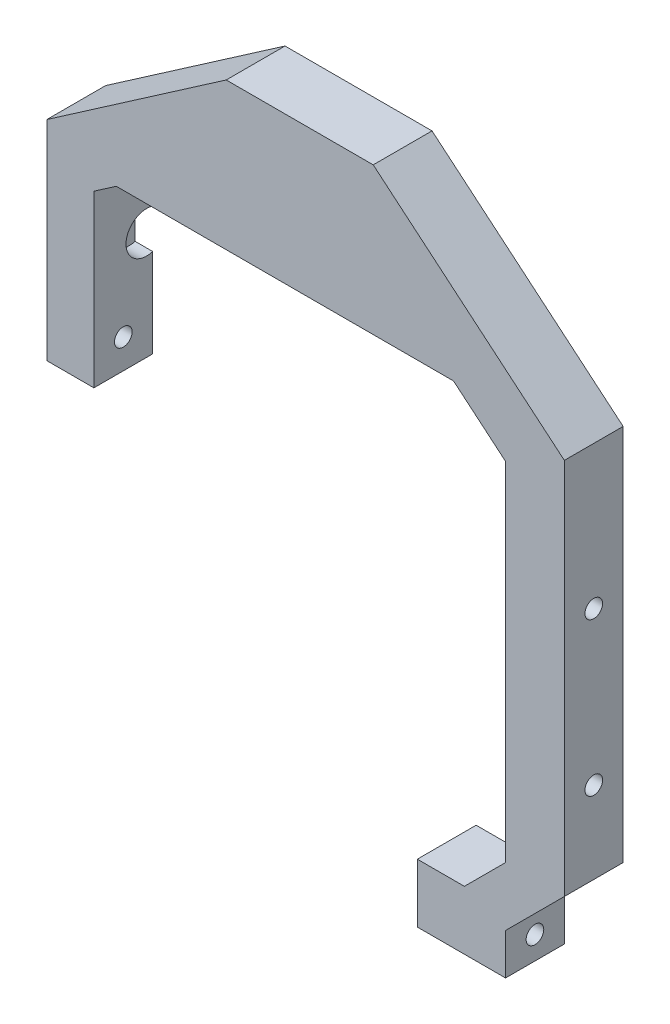
ISO-10303-21;
HEADER;
FILE_DESCRIPTION(('STEP AP214'),'2;1');
FILE_NAME('part.step','',(''),(''),'','','');
FILE_SCHEMA(('AUTOMOTIVE_DESIGN { 1 0 10303 214 1 1 1 1 }'));
ENDSEC;
DATA;
#1=APPLICATION_CONTEXT('core data for automotive mechanical design processes');
#2=APPLICATION_PROTOCOL_DEFINITION('international standard','automotive_design',2000,#1);
#3=PRODUCT_CONTEXT('',#1,'mechanical');
#4=PRODUCT('Part','Part','',(#3));
#5=PRODUCT_RELATED_PRODUCT_CATEGORY('part','',(#4));
#6=PRODUCT_DEFINITION_FORMATION('','',#4);
#7=PRODUCT_DEFINITION_CONTEXT('part definition',#1,'design');
#8=PRODUCT_DEFINITION('design','',#6,#7);
#9=PRODUCT_DEFINITION_SHAPE('','',#8);
#10=(LENGTH_UNIT() NAMED_UNIT(*) SI_UNIT(.MILLI.,.METRE.));
#11=(NAMED_UNIT(*) PLANE_ANGLE_UNIT() SI_UNIT($,.RADIAN.));
#12=(NAMED_UNIT(*) SI_UNIT($,.STERADIAN.) SOLID_ANGLE_UNIT());
#13=UNCERTAINTY_MEASURE_WITH_UNIT(LENGTH_MEASURE(1.E-05),#10,'distance_accuracy_value','');
#14=(GEOMETRIC_REPRESENTATION_CONTEXT(3) GLOBAL_UNCERTAINTY_ASSIGNED_CONTEXT((#13)) GLOBAL_UNIT_ASSIGNED_CONTEXT((#10,
#11,#12)) REPRESENTATION_CONTEXT('',''));
#15=CARTESIAN_POINT('',(0.,0.,0.));
#16=DIRECTION('',(0.,0.,1.));
#17=DIRECTION('',(1.,0.,0.));
#18=AXIS2_PLACEMENT_3D('',#15,#16,#17);
#19=CARTESIAN_POINT('',(-43.6903409986961,-25.0000000000002,10.));
#20=DIRECTION('',(-0.568508389326176,0.822677464906969,0.));
#21=DIRECTION('',(-0.822677464906969,-0.568508389326176,0.));
#22=AXIS2_PLACEMENT_3D('',#19,#20,#21);
#23=PLANE('',#22);
#24=DIRECTION('',(0.822677464906969,0.568508389326176,0.));
#25=VECTOR('',#24,1.);
#26=CARTESIAN_POINT('',(-43.6903409986961,-25.0000000000002,0.));
#27=LINE('',#26,#25);
#28=CARTESIAN_POINT('',(-47.5000000000006,-27.632651549485,0.));
#29=VERTEX_POINT('',#28);
#30=CARTESIAN_POINT('',(-43.6903409986961,-25.0000000000002,0.));
#31=VERTEX_POINT('',#30);
#32=EDGE_CURVE('E464',#29,#31,#27,.T.);
#33=ORIENTED_EDGE('',*,*,#32,.T.);
#34=DIRECTION('',(0.,0.,-1.));
#35=VECTOR('',#34,1.);
#36=CARTESIAN_POINT('',(-43.6903409986961,-25.0000000000002,10.));
#37=LINE('',#36,#35);
#38=CARTESIAN_POINT('',(-43.6903409986961,-25.0000000000002,10.));
#39=VERTEX_POINT('',#38);
#40=EDGE_CURVE('E268',#39,#31,#37,.T.);
#41=ORIENTED_EDGE('',*,*,#40,.F.);
#42=DIRECTION('',(0.822677464906969,0.568508389326176,0.));
#43=VECTOR('',#42,1.);
#44=CARTESIAN_POINT('',(-43.6903409986961,-25.0000000000002,10.));
#45=LINE('',#44,#43);
#46=CARTESIAN_POINT('',(-47.5000000000006,-27.632651549485,10.));
#47=VERTEX_POINT('',#46);
#48=EDGE_CURVE('E467',#47,#39,#45,.T.);
#49=ORIENTED_EDGE('',*,*,#48,.F.);
#50=DIRECTION('',(0.,0.,-1.));
#51=VECTOR('',#50,1.);
#52=CARTESIAN_POINT('',(-47.5000000000006,-27.632651549485,10.));
#53=LINE('',#52,#51);
#54=EDGE_CURVE('E271',#47,#29,#53,.T.);
#55=ORIENTED_EDGE('',*,*,#54,.T.);
#56=EDGE_LOOP('',(#33,#41,#49,#55));
#57=FACE_BOUND('',#56,.T.);
#58=ADVANCED_FACE('F33',(#57),#23,.F.);
#59=CARTESIAN_POINT('',(13.6614108506336,-25.0000000000002,10.));
#60=DIRECTION('',(0.,1.,0.));
#61=DIRECTION('',(0.,0.,1.));
#62=AXIS2_PLACEMENT_3D('',#59,#60,#61);
#63=PLANE('',#62);
#64=DIRECTION('',(1.,0.,0.));
#65=VECTOR('',#64,1.);
#66=CARTESIAN_POINT('',(13.6614108506336,-25.0000000000002,0.));
#67=LINE('',#66,#65);
#68=CARTESIAN_POINT('',(13.6614108506336,-25.0000000000002,0.));
#69=VERTEX_POINT('',#68);
#70=EDGE_CURVE('E495',#31,#69,#67,.T.);
#71=ORIENTED_EDGE('',*,*,#70,.T.);
#72=DIRECTION('',(0.,0.,-1.));
#73=VECTOR('',#72,1.);
#74=CARTESIAN_POINT('',(13.6614108506336,-25.0000000000002,10.));
#75=LINE('',#74,#73);
#76=CARTESIAN_POINT('',(13.6614108506336,-25.0000000000002,10.));
#77=VERTEX_POINT('',#76);
#78=EDGE_CURVE('E265',#77,#69,#75,.T.);
#79=ORIENTED_EDGE('',*,*,#78,.F.);
#80=DIRECTION('',(1.,0.,0.));
#81=VECTOR('',#80,1.);
#82=CARTESIAN_POINT('',(-35.8578643762684,-25.0000000000002,10.));
#83=LINE('',#82,#81);
#84=EDGE_CURVE('E469',#39,#77,#83,.T.);
#85=ORIENTED_EDGE('',*,*,#84,.F.);
#86=ORIENTED_EDGE('',*,*,#40,.T.);
#87=EDGE_LOOP('',(#71,#79,#85,#86));
#88=FACE_BOUND('',#87,.T.);
#89=ADVANCED_FACE('F320',(#88),#63,.F.);
#90=CARTESIAN_POINT('',(13.6614108506336,-25.0000000000002,10.));
#91=DIRECTION('',(0.64278760968654,0.766044443118977,0.));
#92=DIRECTION('',(-0.766044443118977,0.64278760968654,0.));
#93=AXIS2_PLACEMENT_3D('',#90,#91,#92);
#94=PLANE('',#93);
#95=DIRECTION('',(0.766044443118977,-0.64278760968654,0.));
#96=VECTOR('',#95,1.);
#97=CARTESIAN_POINT('',(13.6614108506336,-25.0000000000002,0.));
#98=LINE('',#97,#96);
#99=CARTESIAN_POINT('',(22.4999999999994,-32.4164568953606,0.));
#100=VERTEX_POINT('',#99);
#101=EDGE_CURVE('E209',#69,#100,#98,.T.);
#102=ORIENTED_EDGE('',*,*,#101,.T.);
#103=DIRECTION('',(0.,0.,-1.));
#104=VECTOR('',#103,1.);
#105=CARTESIAN_POINT('',(22.4999999999994,-32.4164568953606,10.));
#106=LINE('',#105,#104);
#107=CARTESIAN_POINT('',(22.4999999999994,-32.4164568953606,10.));
#108=VERTEX_POINT('',#107);
#109=EDGE_CURVE('E262',#108,#100,#106,.T.);
#110=ORIENTED_EDGE('',*,*,#109,.F.);
#111=DIRECTION('',(0.766044443118977,-0.64278760968654,0.));
#112=VECTOR('',#111,1.);
#113=CARTESIAN_POINT('',(13.6614108506336,-25.0000000000002,10.));
#114=LINE('',#113,#112);
#115=EDGE_CURVE('E471',#77,#108,#114,.T.);
#116=ORIENTED_EDGE('',*,*,#115,.F.);
#117=ORIENTED_EDGE('',*,*,#78,.T.);
#118=EDGE_LOOP('',(#102,#110,#116,#117));
#119=FACE_BOUND('',#118,.T.);
#120=ADVANCED_FACE('F325',(#119),#94,.F.);
#121=CARTESIAN_POINT('',(22.4999999999994,-98.4999999999977,10.));
#122=DIRECTION('',(1.,0.,0.));
#123=DIRECTION('',(0.,1.,0.));
#124=AXIS2_PLACEMENT_3D('',#121,#122,#123);
#125=PLANE('',#124);
#126=CARTESIAN_POINT('',(22.4999999999994,-77.5937015555197,5.));
#127=DIRECTION('',(1.,0.,0.));
#128=DIRECTION('',(0.,1.,0.));
#129=AXIS2_PLACEMENT_3D('',#126,#127,#128);
#130=CIRCLE('',#129,1.5);
#131=CARTESIAN_POINT('',(22.4999999999994,-76.0937015555197,5.));
#132=VERTEX_POINT('',#131);
#133=EDGE_CURVE('E454',#132,#132,#130,.F.);
#134=ORIENTED_EDGE('',*,*,#133,.F.);
#135=EDGE_LOOP('',(#134));
#136=FACE_BOUND('',#135,.T.);
#137=CARTESIAN_POINT('',(22.4999999999994,-51.5937015555197,5.));
#138=DIRECTION('',(1.,0.,0.));
#139=DIRECTION('',(0.,1.,0.));
#140=AXIS2_PLACEMENT_3D('',#137,#138,#139);
#141=CIRCLE('',#140,1.5);
#142=CARTESIAN_POINT('',(22.4999999999994,-50.0937015555197,5.));
#143=VERTEX_POINT('',#142);
#144=EDGE_CURVE('E278',#143,#143,#141,.T.);
#145=ORIENTED_EDGE('',*,*,#144,.T.);
#146=EDGE_LOOP('',(#145));
#147=FACE_BOUND('',#146,.T.);
#148=DIRECTION('',(0.,-1.,0.));
#149=VECTOR('',#148,1.);
#150=CARTESIAN_POINT('',(22.4999999999994,-98.4999999999977,0.));
#151=LINE('',#150,#149);
#152=CARTESIAN_POINT('',(22.4999999999994,-41.5096451357993,0.));
#153=VERTEX_POINT('',#152);
#154=CARTESIAN_POINT('',(22.4999999999994,-60.8234583821298,0.));
#155=VERTEX_POINT('',#154);
#156=EDGE_CURVE('E199',#153,#155,#151,.T.);
#157=ORIENTED_EDGE('',*,*,#156,.T.);
#158=CARTESIAN_POINT('',(22.4999999999994,-64.1665517589566,1.03620783323595));
#159=DIRECTION('',(-1.,0.,0.));
#160=DIRECTION('',(0.,-1.,0.));
#161=AXIS2_PLACEMENT_3D('',#158,#159,#160);
#162=CIRCLE('',#161,3.49999999997753);
#163=CARTESIAN_POINT('',(22.4999999999994,-67.5096451357834,0.));
#164=VERTEX_POINT('',#163);
#165=EDGE_CURVE('E186',#164,#155,#162,.T.);
#166=ORIENTED_EDGE('',*,*,#165,.F.);
#167=CARTESIAN_POINT('',(22.4999999999994,-91.4999999999977,0.));
#168=VERTEX_POINT('',#167);
#169=EDGE_CURVE('E206',#164,#168,#151,.T.);
#170=ORIENTED_EDGE('',*,*,#169,.T.);
#171=DIRECTION('',(0.,0.,1.));
#172=VECTOR('',#171,1.);
#173=CARTESIAN_POINT('',(22.4999999999994,-91.4999999999977,10.));
#174=LINE('',#173,#172);
#175=CARTESIAN_POINT('',(22.4999999999994,-91.4999999999977,10.));
#176=VERTEX_POINT('',#175);
#177=EDGE_CURVE('E282',#168,#176,#174,.T.);
#178=ORIENTED_EDGE('',*,*,#177,.T.);
#179=DIRECTION('',(0.,-1.,0.));
#180=VECTOR('',#179,1.);
#181=CARTESIAN_POINT('',(22.4999999999994,-98.4999999999977,10.));
#182=LINE('',#181,#180);
#183=EDGE_CURVE('E473',#108,#176,#182,.T.);
#184=ORIENTED_EDGE('',*,*,#183,.F.);
#185=ORIENTED_EDGE('',*,*,#109,.T.);
#186=CARTESIAN_POINT('',(22.4999999999994,-34.8234583820987,0.));
#187=VERTEX_POINT('',#186);
#188=EDGE_CURVE('E205',#100,#187,#151,.T.);
#189=ORIENTED_EDGE('',*,*,#188,.T.);
#190=CARTESIAN_POINT('',(22.4999999999994,-38.166551758949,1.03620783323595));
#191=DIRECTION('',(-1.,0.,0.));
#192=DIRECTION('',(0.,-1.,0.));
#193=AXIS2_PLACEMENT_3D('',#190,#191,#192);
#194=CIRCLE('',#193,3.5);
#195=EDGE_CURVE('E204',#153,#187,#194,.T.);
#196=ORIENTED_EDGE('',*,*,#195,.F.);
#197=EDGE_LOOP('',(#157,#166,#170,#178,#184,#185,#189,#196));
#198=FACE_BOUND('',#197,.T.);
#199=ADVANCED_FACE('F202',(#136,#147,#198),#125,.F.);
#200=CARTESIAN_POINT('',(22.4999999999994,-98.4999999999977,10.));
#201=DIRECTION('',(0.,-1.,0.));
#202=DIRECTION('',(0.,0.,-1.));
#203=AXIS2_PLACEMENT_3D('',#200,#201,#202);
#204=PLANE('',#203);
#205=DIRECTION('',(-1.,0.,0.));
#206=VECTOR('',#205,1.);
#207=CARTESIAN_POINT('',(22.4999999999994,-98.4999999999977,10.));
#208=LINE('',#207,#206);
#209=CARTESIAN_POINT('',(15.4999999999993,-98.4999999999977,10.));
#210=VERTEX_POINT('',#209);
#211=CARTESIAN_POINT('',(7.49999999999936,-98.4999999999977,10.));
#212=VERTEX_POINT('',#211);
#213=EDGE_CURVE('E476',#210,#212,#208,.T.);
#214=ORIENTED_EDGE('',*,*,#213,.F.);
#215=DIRECTION('',(0.,0.,-1.));
#216=VECTOR('',#215,1.);
#217=CARTESIAN_POINT('',(15.4999999999993,-98.4999999999977,0.));
#218=LINE('',#217,#216);
#219=CARTESIAN_POINT('',(15.4999999999993,-98.4999999999977,0.));
#220=VERTEX_POINT('',#219);
#221=EDGE_CURVE('E274',#210,#220,#218,.T.);
#222=ORIENTED_EDGE('',*,*,#221,.T.);
#223=DIRECTION('',(-1.,0.,0.));
#224=VECTOR('',#223,1.);
#225=CARTESIAN_POINT('',(22.4999999999994,-98.4999999999977,0.));
#226=LINE('',#225,#224);
#227=CARTESIAN_POINT('',(7.49999999999936,-98.4999999999977,0.));
#228=VERTEX_POINT('',#227);
#229=EDGE_CURVE('E208',#220,#228,#226,.T.);
#230=ORIENTED_EDGE('',*,*,#229,.T.);
#231=DIRECTION('',(0.,0.,-1.));
#232=VECTOR('',#231,1.);
#233=CARTESIAN_POINT('',(7.49999999999936,-98.4999999999977,10.));
#234=LINE('',#233,#232);
#235=EDGE_CURVE('E259',#212,#228,#234,.T.);
#236=ORIENTED_EDGE('',*,*,#235,.F.);
#237=EDGE_LOOP('',(#214,#222,#230,#236));
#238=FACE_BOUND('',#237,.T.);
#239=ADVANCED_FACE('F335',(#238),#204,.F.);
#240=CARTESIAN_POINT('',(7.49999999999936,-98.4999999999977,10.));
#241=DIRECTION('',(1.,0.,0.));
#242=DIRECTION('',(0.,0.,-1.));
#243=AXIS2_PLACEMENT_3D('',#240,#241,#242);
#244=PLANE('',#243);
#245=CARTESIAN_POINT('',(7.49999999999936,-104.593701555524,5.));
#246=DIRECTION('',(1.,0.,0.));
#247=DIRECTION('',(0.,0.,-1.));
#248=AXIS2_PLACEMENT_3D('',#245,#246,#247);
#249=CIRCLE('',#248,1.50000000000797);
#250=CARTESIAN_POINT('',(7.49999999999936,-104.593701555524,3.49999999999204));
#251=VERTEX_POINT('',#250);
#252=EDGE_CURVE('E430',#251,#251,#249,.F.);
#253=ORIENTED_EDGE('',*,*,#252,.F.);
#254=EDGE_LOOP('',(#253));
#255=FACE_BOUND('',#254,.T.);
#256=DIRECTION('',(0.,-1.,0.));
#257=VECTOR('',#256,1.);
#258=CARTESIAN_POINT('',(7.49999999999936,-98.4999999999977,0.));
#259=LINE('',#258,#257);
#260=CARTESIAN_POINT('',(7.49999999999936,-108.499999999998,0.));
#261=VERTEX_POINT('',#260);
#262=EDGE_CURVE('E214',#228,#261,#259,.T.);
#263=ORIENTED_EDGE('',*,*,#262,.T.);
#264=DIRECTION('',(0.,0.,-1.));
#265=VECTOR('',#264,1.);
#266=CARTESIAN_POINT('',(7.49999999999936,-108.499999999998,10.));
#267=LINE('',#266,#265);
#268=CARTESIAN_POINT('',(7.49999999999936,-108.499999999998,10.));
#269=VERTEX_POINT('',#268);
#270=EDGE_CURVE('E256',#269,#261,#267,.T.);
#271=ORIENTED_EDGE('',*,*,#270,.F.);
#272=DIRECTION('',(0.,-1.,0.));
#273=VECTOR('',#272,1.);
#274=CARTESIAN_POINT('',(7.49999999999936,-98.4999999999977,10.));
#275=LINE('',#274,#273);
#276=EDGE_CURVE('E478',#212,#269,#275,.T.);
#277=ORIENTED_EDGE('',*,*,#276,.F.);
#278=ORIENTED_EDGE('',*,*,#235,.T.);
#279=EDGE_LOOP('',(#263,#271,#277,#278));
#280=FACE_BOUND('',#279,.T.);
#281=ADVANCED_FACE('F339',(#255,#280),#244,.F.);
#282=CARTESIAN_POINT('',(32.4999999999994,-108.499999999998,10.));
#283=DIRECTION('',(0.,1.,0.));
#284=DIRECTION('',(-1.,0.,0.));
#285=AXIS2_PLACEMENT_3D('',#282,#283,#284);
#286=PLANE('',#285);
#287=DIRECTION('',(1.,0.,0.));
#288=VECTOR('',#287,1.);
#289=CARTESIAN_POINT('',(32.4999999999994,-108.499999999998,0.));
#290=LINE('',#289,#288);
#291=CARTESIAN_POINT('',(22.4999999999997,-108.499999999998,0.));
#292=VERTEX_POINT('',#291);
#293=EDGE_CURVE('E216',#261,#292,#290,.T.);
#294=ORIENTED_EDGE('',*,*,#293,.T.);
#295=DIRECTION('',(0.,0.,1.));
#296=VECTOR('',#295,1.);
#297=CARTESIAN_POINT('',(22.4999999999997,-108.499999999998,-0.000999999999999265));
#298=LINE('',#297,#296);
#299=CARTESIAN_POINT('',(22.4999999999997,-108.499999999998,10.));
#300=VERTEX_POINT('',#299);
#301=EDGE_CURVE('E445',#292,#300,#298,.T.);
#302=ORIENTED_EDGE('',*,*,#301,.T.);
#303=DIRECTION('',(1.,0.,0.));
#304=VECTOR('',#303,1.);
#305=CARTESIAN_POINT('',(32.4999999999994,-108.499999999998,10.));
#306=LINE('',#305,#304);
#307=EDGE_CURVE('E480',#269,#300,#306,.T.);
#308=ORIENTED_EDGE('',*,*,#307,.F.);
#309=ORIENTED_EDGE('',*,*,#270,.T.);
#310=EDGE_LOOP('',(#294,#302,#308,#309));
#311=FACE_BOUND('',#310,.T.);
#312=ADVANCED_FACE('F343',(#311),#286,.F.);
#313=CARTESIAN_POINT('',(32.4999999999994,-27.2707380132612,10.));
#314=DIRECTION('',(-1.,0.,0.));
#315=DIRECTION('',(0.,-1.,0.));
#316=AXIS2_PLACEMENT_3D('',#313,#314,#315);
#317=PLANE('',#316);
#318=CARTESIAN_POINT('',(32.4999999999994,-77.5937015555197,5.));
#319=DIRECTION('',(1.,0.,0.));
#320=DIRECTION('',(0.,1.,0.));
#321=AXIS2_PLACEMENT_3D('',#318,#319,#320);
#322=CIRCLE('',#321,1.5);
#323=CARTESIAN_POINT('',(32.4999999999994,-76.0937015555197,5.));
#324=VERTEX_POINT('',#323);
#325=EDGE_CURVE('E448',#324,#324,#322,.T.);
#326=ORIENTED_EDGE('',*,*,#325,.F.);
#327=EDGE_LOOP('',(#326));
#328=FACE_BOUND('',#327,.T.);
#329=CARTESIAN_POINT('',(32.4999999999994,-51.5937015555197,5.));
#330=DIRECTION('',(-1.,0.,0.));
#331=DIRECTION('',(0.,-1.,0.));
#332=AXIS2_PLACEMENT_3D('',#329,#330,#331);
#333=CIRCLE('',#332,1.5);
#334=CARTESIAN_POINT('',(32.4999999999994,-53.0937015555197,5.));
#335=VERTEX_POINT('',#334);
#336=EDGE_CURVE('E279',#335,#335,#333,.T.);
#337=ORIENTED_EDGE('',*,*,#336,.T.);
#338=EDGE_LOOP('',(#337));
#339=FACE_BOUND('',#338,.T.);
#340=DIRECTION('',(0.,1.,0.));
#341=VECTOR('',#340,1.);
#342=CARTESIAN_POINT('',(32.4999999999994,-40.4999999999977,10.));
#343=LINE('',#342,#341);
#344=CARTESIAN_POINT('',(32.4999999999997,-91.4999999999977,10.));
#345=VERTEX_POINT('',#344);
#346=CARTESIAN_POINT('',(32.4999999999994,-27.2707380132612,10.));
#347=VERTEX_POINT('',#346);
#348=EDGE_CURVE('E483',#345,#347,#343,.T.);
#349=ORIENTED_EDGE('',*,*,#348,.F.);
#350=DIRECTION('',(0.,0.,1.));
#351=VECTOR('',#350,1.);
#352=CARTESIAN_POINT('',(32.4999999999997,-91.4999999999977,-0.000999999999999265));
#353=LINE('',#352,#351);
#354=CARTESIAN_POINT('',(32.4999999999997,-91.4999999999977,0.));
#355=VERTEX_POINT('',#354);
#356=EDGE_CURVE('E444',#355,#345,#353,.T.);
#357=ORIENTED_EDGE('',*,*,#356,.F.);
#358=DIRECTION('',(0.,1.,0.));
#359=VECTOR('',#358,1.);
#360=CARTESIAN_POINT('',(32.4999999999994,-27.2707380132612,0.));
#361=LINE('',#360,#359);
#362=CARTESIAN_POINT('',(32.4999999999994,-27.2707380132612,0.));
#363=VERTEX_POINT('',#362);
#364=EDGE_CURVE('E219',#355,#363,#361,.T.);
#365=ORIENTED_EDGE('',*,*,#364,.T.);
#366=DIRECTION('',(0.,0.,-1.));
#367=VECTOR('',#366,1.);
#368=CARTESIAN_POINT('',(32.4999999999994,-27.2707380132612,10.));
#369=LINE('',#368,#367);
#370=EDGE_CURVE('E253',#347,#363,#369,.T.);
#371=ORIENTED_EDGE('',*,*,#370,.F.);
#372=EDGE_LOOP('',(#349,#357,#365,#371));
#373=FACE_BOUND('',#372,.T.);
#374=ADVANCED_FACE('F347',(#328,#339,#373),#317,.F.);
#375=CARTESIAN_POINT('',(0.,0.,10.));
#376=DIRECTION('',(-0.64278760968654,-0.766044443118977,0.));
#377=DIRECTION('',(0.766044443118977,-0.64278760968654,0.));
#378=AXIS2_PLACEMENT_3D('',#375,#376,#377);
#379=PLANE('',#378);
#380=DIRECTION('',(-0.766044443118977,0.64278760968654,0.));
#381=VECTOR('',#380,1.);
#382=CARTESIAN_POINT('',(0.,0.,0.));
#383=LINE('',#382,#381);
#384=CARTESIAN_POINT('',(0.,0.,0.));
#385=VERTEX_POINT('',#384);
#386=EDGE_CURVE('E221',#363,#385,#383,.T.);
#387=ORIENTED_EDGE('',*,*,#386,.T.);
#388=DIRECTION('',(0.,0.,-1.));
#389=VECTOR('',#388,1.);
#390=CARTESIAN_POINT('',(0.,0.,10.));
#391=LINE('',#390,#389);
#392=CARTESIAN_POINT('',(0.,0.,10.));
#393=VERTEX_POINT('',#392);
#394=EDGE_CURVE('E250',#393,#385,#391,.T.);
#395=ORIENTED_EDGE('',*,*,#394,.F.);
#396=DIRECTION('',(-0.766044443118977,0.64278760968654,0.));
#397=VECTOR('',#396,1.);
#398=CARTESIAN_POINT('',(0.,0.,10.));
#399=LINE('',#398,#397);
#400=EDGE_CURVE('E485',#347,#393,#399,.T.);
#401=ORIENTED_EDGE('',*,*,#400,.F.);
#402=ORIENTED_EDGE('',*,*,#370,.T.);
#403=EDGE_LOOP('',(#387,#395,#401,#402));
#404=FACE_BOUND('',#403,.T.);
#405=ADVANCED_FACE('F351',(#404),#379,.F.);
#406=CARTESIAN_POINT('',(-24.9999999999997,0.,10.));
#407=DIRECTION('',(0.,-1.,0.));
#408=DIRECTION('',(1.,0.,0.));
#409=AXIS2_PLACEMENT_3D('',#406,#407,#408);
#410=PLANE('',#409);
#411=DIRECTION('',(-1.,0.,0.));
#412=VECTOR('',#411,1.);
#413=CARTESIAN_POINT('',(-24.9999999999997,0.,0.));
#414=LINE('',#413,#412);
#415=CARTESIAN_POINT('',(-24.9999999999997,0.,0.));
#416=VERTEX_POINT('',#415);
#417=EDGE_CURVE('E223',#385,#416,#414,.T.);
#418=ORIENTED_EDGE('',*,*,#417,.T.);
#419=DIRECTION('',(0.,0.,-1.));
#420=VECTOR('',#419,1.);
#421=CARTESIAN_POINT('',(-24.9999999999997,0.,10.));
#422=LINE('',#421,#420);
#423=CARTESIAN_POINT('',(-24.9999999999997,0.,10.));
#424=VERTEX_POINT('',#423);
#425=EDGE_CURVE('E247',#424,#416,#422,.T.);
#426=ORIENTED_EDGE('',*,*,#425,.F.);
#427=DIRECTION('',(-1.,0.,0.));
#428=VECTOR('',#427,1.);
#429=CARTESIAN_POINT('',(-24.9999999999997,0.,10.));
#430=LINE('',#429,#428);
#431=EDGE_CURVE('E487',#393,#424,#430,.T.);
#432=ORIENTED_EDGE('',*,*,#431,.F.);
#433=ORIENTED_EDGE('',*,*,#394,.T.);
#434=EDGE_LOOP('',(#418,#426,#432,#433));
#435=FACE_BOUND('',#434,.T.);
#436=ADVANCED_FACE('F355',(#435),#410,.F.);
#437=CARTESIAN_POINT('',(-55.5000000000006,-21.0769184937011,10.));
#438=DIRECTION('',(0.568508389326175,-0.82267746490697,0.));
#439=DIRECTION('',(0.82267746490697,0.568508389326175,0.));
#440=AXIS2_PLACEMENT_3D('',#437,#438,#439);
#441=PLANE('',#440);
#442=DIRECTION('',(-0.82267746490697,-0.568508389326175,0.));
#443=VECTOR('',#442,1.);
#444=CARTESIAN_POINT('',(-55.5000000000006,-21.0769184937011,0.));
#445=LINE('',#444,#443);
#446=CARTESIAN_POINT('',(-55.5000000000006,-21.0769184937011,0.));
#447=VERTEX_POINT('',#446);
#448=EDGE_CURVE('E225',#416,#447,#445,.T.);
#449=ORIENTED_EDGE('',*,*,#448,.T.);
#450=DIRECTION('',(0.,0.,-1.));
#451=VECTOR('',#450,1.);
#452=CARTESIAN_POINT('',(-55.5000000000006,-21.0769184937011,10.));
#453=LINE('',#452,#451);
#454=CARTESIAN_POINT('',(-55.5000000000006,-21.0769184937011,10.));
#455=VERTEX_POINT('',#454);
#456=EDGE_CURVE('E244',#455,#447,#453,.T.);
#457=ORIENTED_EDGE('',*,*,#456,.F.);
#458=DIRECTION('',(-0.82267746490697,-0.568508389326175,0.));
#459=VECTOR('',#458,1.);
#460=CARTESIAN_POINT('',(-55.5000000000006,-21.0769184937011,10.));
#461=LINE('',#460,#459);
#462=EDGE_CURVE('E489',#424,#455,#461,.T.);
#463=ORIENTED_EDGE('',*,*,#462,.F.);
#464=ORIENTED_EDGE('',*,*,#425,.T.);
#465=EDGE_LOOP('',(#449,#457,#463,#464));
#466=FACE_BOUND('',#465,.T.);
#467=ADVANCED_FACE('F359',(#466),#441,.F.);
#468=CARTESIAN_POINT('',(-55.5000000000006,-56.5937015555197,10.));
#469=DIRECTION('',(1.,0.,0.));
#470=DIRECTION('',(0.,1.,0.));
#471=AXIS2_PLACEMENT_3D('',#468,#469,#470);
#472=PLANE('',#471);
#473=CARTESIAN_POINT('',(-55.5000000000006,-51.5937015555197,5.));
#474=DIRECTION('',(-1.,0.,0.));
#475=DIRECTION('',(0.,-1.,0.));
#476=AXIS2_PLACEMENT_3D('',#473,#474,#475);
#477=CIRCLE('',#476,1.5);
#478=CARTESIAN_POINT('',(-55.5000000000006,-53.0937015555197,5.));
#479=VERTEX_POINT('',#478);
#480=EDGE_CURVE('E457',#479,#479,#477,.T.);
#481=ORIENTED_EDGE('',*,*,#480,.F.);
#482=EDGE_LOOP('',(#481));
#483=FACE_BOUND('',#482,.T.);
#484=DIRECTION('',(0.,-1.,0.));
#485=VECTOR('',#484,1.);
#486=CARTESIAN_POINT('',(-55.5000000000006,-56.5937015555197,0.));
#487=LINE('',#486,#485);
#488=CARTESIAN_POINT('',(-55.5000000000006,-56.5937015555197,0.));
#489=VERTEX_POINT('',#488);
#490=EDGE_CURVE('E228',#447,#489,#487,.T.);
#491=ORIENTED_EDGE('',*,*,#490,.T.);
#492=DIRECTION('',(0.,0.,-1.));
#493=VECTOR('',#492,1.);
#494=CARTESIAN_POINT('',(-55.5000000000006,-56.5937015555197,10.));
#495=LINE('',#494,#493);
#496=CARTESIAN_POINT('',(-55.5000000000006,-56.5937015555197,10.));
#497=VERTEX_POINT('',#496);
#498=EDGE_CURVE('E240',#497,#489,#495,.T.);
#499=ORIENTED_EDGE('',*,*,#498,.F.);
#500=DIRECTION('',(0.,-1.,0.));
#501=VECTOR('',#500,1.);
#502=CARTESIAN_POINT('',(-55.5000000000006,-21.0769184937011,10.));
#503=LINE('',#502,#501);
#504=EDGE_CURVE('E491',#455,#497,#503,.T.);
#505=ORIENTED_EDGE('',*,*,#504,.F.);
#506=ORIENTED_EDGE('',*,*,#456,.T.);
#507=EDGE_LOOP('',(#491,#499,#505,#506));
#508=FACE_BOUND('',#507,.T.);
#509=ADVANCED_FACE('F363',(#483,#508),#472,.F.);
#510=CARTESIAN_POINT('',(-47.5000000000006,-56.5937015555197,10.));
#511=DIRECTION('',(0.,1.,0.));
#512=DIRECTION('',(0.,0.,1.));
#513=AXIS2_PLACEMENT_3D('',#510,#511,#512);
#514=PLANE('',#513);
#515=DIRECTION('',(1.,0.,0.));
#516=VECTOR('',#515,1.);
#517=CARTESIAN_POINT('',(-47.5000000000006,-56.5937015555197,0.));
#518=LINE('',#517,#516);
#519=CARTESIAN_POINT('',(-47.5000000000006,-56.5937015555197,0.));
#520=VERTEX_POINT('',#519);
#521=EDGE_CURVE('E230',#489,#520,#518,.T.);
#522=ORIENTED_EDGE('',*,*,#521,.T.);
#523=DIRECTION('',(0.,0.,-1.));
#524=VECTOR('',#523,1.);
#525=CARTESIAN_POINT('',(-47.5000000000006,-56.5937015555197,10.));
#526=LINE('',#525,#524);
#527=CARTESIAN_POINT('',(-47.5000000000006,-56.5937015555197,10.));
#528=VERTEX_POINT('',#527);
#529=EDGE_CURVE('E237',#528,#520,#526,.T.);
#530=ORIENTED_EDGE('',*,*,#529,.F.);
#531=DIRECTION('',(1.,0.,0.));
#532=VECTOR('',#531,1.);
#533=CARTESIAN_POINT('',(-47.5000000000006,-56.5937015555197,10.));
#534=LINE('',#533,#532);
#535=EDGE_CURVE('E241',#497,#528,#534,.T.);
#536=ORIENTED_EDGE('',*,*,#535,.F.);
#537=ORIENTED_EDGE('',*,*,#498,.T.);
#538=EDGE_LOOP('',(#522,#530,#536,#537));
#539=FACE_BOUND('',#538,.T.);
#540=ADVANCED_FACE('F367',(#539),#514,.F.);
#541=CARTESIAN_POINT('',(-47.5000000000006,-36.6421356192506,10.));
#542=DIRECTION('',(-1.,0.,0.));
#543=DIRECTION('',(0.,0.,1.));
#544=AXIS2_PLACEMENT_3D('',#541,#542,#543);
#545=PLANE('',#544);
#546=CARTESIAN_POINT('',(-47.5000000000006,-51.5937015555197,5.));
#547=DIRECTION('',(-1.,0.,0.));
#548=DIRECTION('',(0.,0.,1.));
#549=AXIS2_PLACEMENT_3D('',#546,#547,#548);
#550=CIRCLE('',#549,1.5);
#551=CARTESIAN_POINT('',(-47.5000000000006,-51.5937015555197,6.5));
#552=VERTEX_POINT('',#551);
#553=EDGE_CURVE('E275',#552,#552,#550,.T.);
#554=ORIENTED_EDGE('',*,*,#553,.T.);
#555=EDGE_LOOP('',(#554));
#556=FACE_BOUND('',#555,.T.);
#557=DIRECTION('',(0.,1.,0.));
#558=VECTOR('',#557,1.);
#559=CARTESIAN_POINT('',(-47.5000000000006,-36.6421356192506,0.));
#560=LINE('',#559,#558);
#561=CARTESIAN_POINT('',(-47.5000000000006,-41.5096451358014,0.));
#562=VERTEX_POINT('',#561);
#563=EDGE_CURVE('E233',#520,#562,#560,.T.);
#564=ORIENTED_EDGE('',*,*,#563,.T.);
#565=CARTESIAN_POINT('',(-47.5000000000006,-38.1665517589508,1.03620783323509));
#566=DIRECTION('',(1.,0.,0.));
#567=DIRECTION('',(0.,0.,-1.));
#568=AXIS2_PLACEMENT_3D('',#565,#566,#567);
#569=CIRCLE('',#568,3.5);
#570=CARTESIAN_POINT('',(-47.5000000000006,-34.8234583821002,0.));
#571=VERTEX_POINT('',#570);
#572=EDGE_CURVE('E415',#571,#562,#569,.T.);
#573=ORIENTED_EDGE('',*,*,#572,.F.);
#574=EDGE_CURVE('E232',#571,#29,#560,.T.);
#575=ORIENTED_EDGE('',*,*,#574,.T.);
#576=ORIENTED_EDGE('',*,*,#54,.F.);
#577=DIRECTION('',(0.,1.,0.));
#578=VECTOR('',#577,1.);
#579=CARTESIAN_POINT('',(-47.5000000000006,-27.632651549485,10.));
#580=LINE('',#579,#578);
#581=EDGE_CURVE('E236',#528,#47,#580,.T.);
#582=ORIENTED_EDGE('',*,*,#581,.F.);
#583=ORIENTED_EDGE('',*,*,#529,.T.);
#584=EDGE_LOOP('',(#564,#573,#575,#576,#582,#583));
#585=FACE_BOUND('',#584,.T.);
#586=ADVANCED_FACE('F371',(#556,#585),#545,.F.);
#587=CARTESIAN_POINT('',(-47.5000000000006,-56.5937015555197,10.));
#588=DIRECTION('',(0.,0.,-1.));
#589=DIRECTION('',(-1.,0.,0.));
#590=AXIS2_PLACEMENT_3D('',#587,#588,#589);
#591=PLANE('',#590);
#592=ORIENTED_EDGE('',*,*,#307,.T.);
#593=DIRECTION('',(0.,-1.,0.));
#594=VECTOR('',#593,1.);
#595=CARTESIAN_POINT('',(22.4999999999997,-108.499999999998,10.));
#596=LINE('',#595,#594);
#597=CARTESIAN_POINT('',(22.4999999999997,-101.499999999998,10.));
#598=VERTEX_POINT('',#597);
#599=EDGE_CURVE('E442',#598,#300,#596,.T.);
#600=ORIENTED_EDGE('',*,*,#599,.F.);
#601=DIRECTION('',(-0.707106781186549,-0.707106781186546,0.));
#602=VECTOR('',#601,1.);
#603=CARTESIAN_POINT('',(22.4999999999997,-101.499999999998,10.));
#604=LINE('',#603,#602);
#605=EDGE_CURVE('E439',#345,#598,#604,.T.);
#606=ORIENTED_EDGE('',*,*,#605,.F.);
#607=ORIENTED_EDGE('',*,*,#348,.T.);
#608=ORIENTED_EDGE('',*,*,#400,.T.);
#609=ORIENTED_EDGE('',*,*,#431,.T.);
#610=ORIENTED_EDGE('',*,*,#462,.T.);
#611=ORIENTED_EDGE('',*,*,#504,.T.);
#612=ORIENTED_EDGE('',*,*,#535,.T.);
#613=ORIENTED_EDGE('',*,*,#581,.T.);
#614=ORIENTED_EDGE('',*,*,#48,.T.);
#615=ORIENTED_EDGE('',*,*,#84,.T.);
#616=ORIENTED_EDGE('',*,*,#115,.T.);
#617=ORIENTED_EDGE('',*,*,#183,.T.);
#618=DIRECTION('',(0.707106781186552,0.707106781186543,0.));
#619=VECTOR('',#618,1.);
#620=CARTESIAN_POINT('',(4.95314922223801,-109.046850777759,10.));
#621=LINE('',#620,#619);
#622=EDGE_CURVE('E287',#176,#210,#621,.F.);
#623=ORIENTED_EDGE('',*,*,#622,.T.);
#624=ORIENTED_EDGE('',*,*,#213,.T.);
#625=ORIENTED_EDGE('',*,*,#276,.T.);
#626=EDGE_LOOP('',(#592,#600,#606,#607,#608,#609,#610,#611,#612,#613,#614,#615,#616,#617,#623,
#624,#625));
#627=FACE_BOUND('',#626,.T.);
#628=ADVANCED_FACE('F375',(#627),#591,.F.);
#629=CARTESIAN_POINT('',(-47.5000000000006,-56.5937015555197,0.));
#630=DIRECTION('',(0.,0.,-1.));
#631=DIRECTION('',(-1.,0.,0.));
#632=AXIS2_PLACEMENT_3D('',#629,#630,#631);
#633=PLANE('',#632);
#634=DIRECTION('',(-1.,0.,0.));
#635=VECTOR('',#634,1.);
#636=CARTESIAN_POINT('',(25.4999999999994,-67.5096451357834,0.));
#637=LINE('',#636,#635);
#638=CARTESIAN_POINT('',(25.4999999999994,-67.5096451357834,0.));
#639=VERTEX_POINT('',#638);
#640=EDGE_CURVE('E11',#639,#164,#637,.T.);
#641=ORIENTED_EDGE('',*,*,#640,.F.);
#642=DIRECTION('',(0.,1.,0.));
#643=VECTOR('',#642,1.);
#644=CARTESIAN_POINT('',(25.4999999999994,-56.5937015555197,0.));
#645=LINE('',#644,#643);
#646=CARTESIAN_POINT('',(25.4999999999994,-60.8234583821298,0.));
#647=VERTEX_POINT('',#646);
#648=EDGE_CURVE('E200',#639,#647,#645,.T.);
#649=ORIENTED_EDGE('',*,*,#648,.T.);
#650=DIRECTION('',(-1.,0.,0.));
#651=VECTOR('',#650,1.);
#652=CARTESIAN_POINT('',(25.4999999999994,-60.8234583821298,0.));
#653=LINE('',#652,#651);
#654=EDGE_CURVE('E41',#155,#647,#653,.F.);
#655=ORIENTED_EDGE('',*,*,#654,.F.);
#656=ORIENTED_EDGE('',*,*,#156,.F.);
#657=DIRECTION('',(-1.,0.,0.));
#658=VECTOR('',#657,1.);
#659=CARTESIAN_POINT('',(25.4999999999994,-41.5096451357993,0.));
#660=LINE('',#659,#658);
#661=CARTESIAN_POINT('',(25.4999999999994,-41.5096451357993,0.));
#662=VERTEX_POINT('',#661);
#663=EDGE_CURVE('E302',#662,#153,#660,.T.);
#664=ORIENTED_EDGE('',*,*,#663,.F.);
#665=DIRECTION('',(0.,1.,0.));
#666=VECTOR('',#665,1.);
#667=CARTESIAN_POINT('',(25.4999999999994,-56.5937015555197,0.));
#668=LINE('',#667,#666);
#669=CARTESIAN_POINT('',(25.4999999999994,-34.8234583820987,0.));
#670=VERTEX_POINT('',#669);
#671=EDGE_CURVE('E297',#662,#670,#668,.T.);
#672=ORIENTED_EDGE('',*,*,#671,.T.);
#673=DIRECTION('',(-1.,0.,0.));
#674=VECTOR('',#673,1.);
#675=CARTESIAN_POINT('',(25.4999999999994,-34.8234583820987,0.));
#676=LINE('',#675,#674);
#677=EDGE_CURVE('E300',#187,#670,#676,.F.);
#678=ORIENTED_EDGE('',*,*,#677,.F.);
#679=ORIENTED_EDGE('',*,*,#188,.F.);
#680=ORIENTED_EDGE('',*,*,#101,.F.);
#681=ORIENTED_EDGE('',*,*,#70,.F.);
#682=ORIENTED_EDGE('',*,*,#32,.F.);
#683=ORIENTED_EDGE('',*,*,#574,.F.);
#684=DIRECTION('',(1.,0.,0.));
#685=VECTOR('',#684,1.);
#686=CARTESIAN_POINT('',(-50.5000000000006,-34.8234583821002,0.));
#687=LINE('',#686,#685);
#688=CARTESIAN_POINT('',(-50.5000000000006,-34.8234583821002,0.));
#689=VERTEX_POINT('',#688);
#690=EDGE_CURVE('E295',#689,#571,#687,.T.);
#691=ORIENTED_EDGE('',*,*,#690,.F.);
#692=DIRECTION('',(0.,-1.,0.));
#693=VECTOR('',#692,1.);
#694=CARTESIAN_POINT('',(-50.5000000000006,-56.5937015555197,0.));
#695=LINE('',#694,#693);
#696=CARTESIAN_POINT('',(-50.5000000000006,-41.5096451358014,0.));
#697=VERTEX_POINT('',#696);
#698=EDGE_CURVE('E289',#689,#697,#695,.T.);
#699=ORIENTED_EDGE('',*,*,#698,.T.);
#700=DIRECTION('',(1.,0.,0.));
#701=VECTOR('',#700,1.);
#702=CARTESIAN_POINT('',(-50.5000000000006,-41.5096451358014,0.));
#703=LINE('',#702,#701);
#704=EDGE_CURVE('E292',#562,#697,#703,.F.);
#705=ORIENTED_EDGE('',*,*,#704,.F.);
#706=ORIENTED_EDGE('',*,*,#563,.F.);
#707=ORIENTED_EDGE('',*,*,#521,.F.);
#708=ORIENTED_EDGE('',*,*,#490,.F.);
#709=ORIENTED_EDGE('',*,*,#448,.F.);
#710=ORIENTED_EDGE('',*,*,#417,.F.);
#711=ORIENTED_EDGE('',*,*,#386,.F.);
#712=ORIENTED_EDGE('',*,*,#364,.F.);
#713=DIRECTION('',(-0.707106781186549,-0.707106781186546,0.));
#714=VECTOR('',#713,1.);
#715=CARTESIAN_POINT('',(22.4999999999997,-101.499999999998,0.));
#716=LINE('',#715,#714);
#717=CARTESIAN_POINT('',(22.4999999999997,-101.499999999998,0.));
#718=VERTEX_POINT('',#717);
#719=EDGE_CURVE('E433',#355,#718,#716,.T.);
#720=ORIENTED_EDGE('',*,*,#719,.T.);
#721=DIRECTION('',(0.,-1.,0.));
#722=VECTOR('',#721,1.);
#723=CARTESIAN_POINT('',(22.4999999999997,-108.499999999998,0.));
#724=LINE('',#723,#722);
#725=EDGE_CURVE('E436',#718,#292,#724,.T.);
#726=ORIENTED_EDGE('',*,*,#725,.T.);
#727=ORIENTED_EDGE('',*,*,#293,.F.);
#728=ORIENTED_EDGE('',*,*,#262,.F.);
#729=ORIENTED_EDGE('',*,*,#229,.F.);
#730=DIRECTION('',(-0.707106781186552,-0.707106781186543,0.));
#731=VECTOR('',#730,1.);
#732=CARTESIAN_POINT('',(15.4999999999993,-98.4999999999977,0.));
#733=LINE('',#732,#731);
#734=EDGE_CURVE('E284',#220,#168,#733,.F.);
#735=ORIENTED_EDGE('',*,*,#734,.T.);
#736=ORIENTED_EDGE('',*,*,#169,.F.);
#737=EDGE_LOOP('',(#641,#649,#655,#656,#664,#672,#678,#679,#680,#681,#682,#683,#691,#699,#705,
#706,#707,#708,#709,#710,#711,#712,#720,#726,#727,#728,#729,#735,#736));
#738=FACE_BOUND('',#737,.T.);
#739=ADVANCED_FACE('F197',(#738),#633,.T.);
#740=CARTESIAN_POINT('',(32.4999999999994,-51.5937015555197,5.));
#741=DIRECTION('',(-1.,0.,0.));
#742=DIRECTION('',(0.,-1.,0.));
#743=AXIS2_PLACEMENT_3D('',#740,#741,#742);
#744=CYLINDRICAL_SURFACE('',#743,1.5);
#745=ORIENTED_EDGE('',*,*,#480,.T.);
#746=EDGE_LOOP('',(#745));
#747=FACE_BOUND('',#746,.T.);
#748=ORIENTED_EDGE('',*,*,#553,.F.);
#749=EDGE_LOOP('',(#748));
#750=FACE_BOUND('',#749,.T.);
#751=ADVANCED_FACE('F379',(#747,#750),#744,.F.);
#752=ORIENTED_EDGE('',*,*,#336,.F.);
#753=EDGE_LOOP('',(#752));
#754=FACE_BOUND('',#753,.T.);
#755=ORIENTED_EDGE('',*,*,#144,.F.);
#756=EDGE_LOOP('',(#755));
#757=FACE_BOUND('',#756,.T.);
#758=ADVANCED_FACE('F383',(#754,#757),#744,.F.);
#759=CARTESIAN_POINT('',(-55.5010000000006,-77.5937015555197,5.));
#760=DIRECTION('',(1.,0.,0.));
#761=DIRECTION('',(0.,1.,0.));
#762=AXIS2_PLACEMENT_3D('',#759,#760,#761);
#763=CYLINDRICAL_SURFACE('',#762,1.5);
#764=ORIENTED_EDGE('',*,*,#325,.T.);
#765=EDGE_LOOP('',(#764));
#766=FACE_BOUND('',#765,.T.);
#767=ORIENTED_EDGE('',*,*,#133,.T.);
#768=EDGE_LOOP('',(#767));
#769=FACE_BOUND('',#768,.T.);
#770=ADVANCED_FACE('F386',(#766,#769),#763,.F.);
#771=CARTESIAN_POINT('',(15.4999999999993,-98.4999999999977,10.));
#772=DIRECTION('',(-0.707106781186543,0.707106781186552,0.));
#773=DIRECTION('',(-0.707106781186552,-0.707106781186543,0.));
#774=AXIS2_PLACEMENT_3D('',#771,#772,#773);
#775=PLANE('',#774);
#776=ORIENTED_EDGE('',*,*,#622,.F.);
#777=ORIENTED_EDGE('',*,*,#177,.F.);
#778=ORIENTED_EDGE('',*,*,#734,.F.);
#779=ORIENTED_EDGE('',*,*,#221,.F.);
#780=EDGE_LOOP('',(#776,#777,#778,#779));
#781=FACE_BOUND('',#780,.T.);
#782=ADVANCED_FACE('F35',(#781),#775,.T.);
#783=CARTESIAN_POINT('',(22.4999999999997,-108.499999999998,-0.000999999999999265));
#784=DIRECTION('',(-1.,0.,0.));
#785=DIRECTION('',(0.,0.,1.));
#786=AXIS2_PLACEMENT_3D('',#783,#784,#785);
#787=PLANE('',#786);
#788=CARTESIAN_POINT('',(22.4999999999997,-104.593701555524,5.));
#789=DIRECTION('',(1.,0.,0.));
#790=DIRECTION('',(0.,0.,-1.));
#791=AXIS2_PLACEMENT_3D('',#788,#789,#790);
#792=CIRCLE('',#791,1.50000000000797);
#793=CARTESIAN_POINT('',(22.4999999999997,-104.593701555524,3.49999999999204));
#794=VERTEX_POINT('',#793);
#795=EDGE_CURVE('E414',#794,#794,#792,.T.);
#796=ORIENTED_EDGE('',*,*,#795,.F.);
#797=EDGE_LOOP('',(#796));
#798=FACE_BOUND('',#797,.T.);
#799=DIRECTION('',(0.,0.,1.));
#800=VECTOR('',#799,1.);
#801=CARTESIAN_POINT('',(22.4999999999997,-101.499999999998,-0.000999999999999265));
#802=LINE('',#801,#800);
#803=EDGE_CURVE('E449',#718,#598,#802,.T.);
#804=ORIENTED_EDGE('',*,*,#803,.T.);
#805=ORIENTED_EDGE('',*,*,#599,.T.);
#806=ORIENTED_EDGE('',*,*,#301,.F.);
#807=ORIENTED_EDGE('',*,*,#725,.F.);
#808=EDGE_LOOP('',(#804,#805,#806,#807));
#809=FACE_BOUND('',#808,.T.);
#810=ADVANCED_FACE('F395',(#798,#809),#787,.F.);
#811=CARTESIAN_POINT('',(22.4999999999997,-101.499999999998,-0.000999999999999265));
#812=DIRECTION('',(-0.707106781186546,0.707106781186549,0.));
#813=DIRECTION('',(-0.707106781186549,-0.707106781186546,0.));
#814=AXIS2_PLACEMENT_3D('',#811,#812,#813);
#815=PLANE('',#814);
#816=ORIENTED_EDGE('',*,*,#356,.T.);
#817=ORIENTED_EDGE('',*,*,#605,.T.);
#818=ORIENTED_EDGE('',*,*,#803,.F.);
#819=ORIENTED_EDGE('',*,*,#719,.F.);
#820=EDGE_LOOP('',(#816,#817,#818,#819));
#821=FACE_BOUND('',#820,.T.);
#822=ADVANCED_FACE('F391',(#821),#815,.F.);
#823=CARTESIAN_POINT('',(-55.5010000000006,-104.593701555524,5.));
#824=DIRECTION('',(1.,0.,0.));
#825=DIRECTION('',(0.,0.,-1.));
#826=AXIS2_PLACEMENT_3D('',#823,#824,#825);
#827=CYLINDRICAL_SURFACE('',#826,1.50000000000797);
#828=ORIENTED_EDGE('',*,*,#795,.T.);
#829=EDGE_LOOP('',(#828));
#830=FACE_BOUND('',#829,.T.);
#831=ORIENTED_EDGE('',*,*,#252,.T.);
#832=EDGE_LOOP('',(#831));
#833=FACE_BOUND('',#832,.T.);
#834=ADVANCED_FACE('F394',(#830,#833),#827,.F.);
#835=CARTESIAN_POINT('',(-50.5000000000006,-38.1665517589508,1.03620783323509));
#836=DIRECTION('',(1.,0.,0.));
#837=DIRECTION('',(0.,0.,-1.));
#838=AXIS2_PLACEMENT_3D('',#835,#836,#837);
#839=CYLINDRICAL_SURFACE('',#838,3.5);
#840=ORIENTED_EDGE('',*,*,#690,.T.);
#841=ORIENTED_EDGE('',*,*,#572,.T.);
#842=ORIENTED_EDGE('',*,*,#704,.T.);
#843=CARTESIAN_POINT('',(-50.5000000000006,-38.1665517589508,1.03620783323509));
#844=DIRECTION('',(1.,0.,0.));
#845=DIRECTION('',(0.,0.,-1.));
#846=AXIS2_PLACEMENT_3D('',#843,#844,#845);
#847=CIRCLE('',#846,3.5);
#848=EDGE_CURVE('E412',#689,#697,#847,.T.);
#849=ORIENTED_EDGE('',*,*,#848,.F.);
#850=EDGE_LOOP('',(#840,#841,#842,#849));
#851=FACE_BOUND('',#850,.T.);
#852=ADVANCED_FACE('F402',(#851),#839,.F.);
#853=CARTESIAN_POINT('',(-50.5000000000006,-38.1665517589508,1.03620783323509));
#854=DIRECTION('',(1.,0.,0.));
#855=DIRECTION('',(0.,0.,-1.));
#856=AXIS2_PLACEMENT_3D('',#853,#854,#855);
#857=PLANE('',#856);
#858=ORIENTED_EDGE('',*,*,#848,.T.);
#859=ORIENTED_EDGE('',*,*,#698,.F.);
#860=EDGE_LOOP('',(#858,#859));
#861=FACE_BOUND('',#860,.T.);
#862=ADVANCED_FACE('F317',(#861),#857,.T.);
#863=CARTESIAN_POINT('',(25.4999999999994,-38.166551758949,1.03620783323595));
#864=DIRECTION('',(-1.,0.,0.));
#865=DIRECTION('',(0.,-1.,0.));
#866=AXIS2_PLACEMENT_3D('',#863,#864,#865);
#867=CYLINDRICAL_SURFACE('',#866,3.5);
#868=ORIENTED_EDGE('',*,*,#663,.T.);
#869=ORIENTED_EDGE('',*,*,#195,.T.);
#870=ORIENTED_EDGE('',*,*,#677,.T.);
#871=CARTESIAN_POINT('',(25.4999999999994,-38.166551758949,1.03620783323595));
#872=DIRECTION('',(-1.,0.,0.));
#873=DIRECTION('',(0.,-1.,0.));
#874=AXIS2_PLACEMENT_3D('',#871,#872,#873);
#875=CIRCLE('',#874,3.5);
#876=EDGE_CURVE('E54',#662,#670,#875,.T.);
#877=ORIENTED_EDGE('',*,*,#876,.F.);
#878=EDGE_LOOP('',(#868,#869,#870,#877));
#879=FACE_BOUND('',#878,.T.);
#880=ADVANCED_FACE('F305',(#879),#867,.F.);
#881=CARTESIAN_POINT('',(25.4999999999994,-38.166551758949,1.03620783323595));
#882=DIRECTION('',(-1.,0.,0.));
#883=DIRECTION('',(0.,-1.,0.));
#884=AXIS2_PLACEMENT_3D('',#881,#882,#883);
#885=PLANE('',#884);
#886=ORIENTED_EDGE('',*,*,#876,.T.);
#887=ORIENTED_EDGE('',*,*,#671,.F.);
#888=EDGE_LOOP('',(#886,#887));
#889=FACE_BOUND('',#888,.T.);
#890=ADVANCED_FACE('F308',(#889),#885,.T.);
#891=CARTESIAN_POINT('',(25.4999999999994,-64.1665517589566,1.03620783323595));
#892=DIRECTION('',(-1.,0.,0.));
#893=DIRECTION('',(0.,-1.,0.));
#894=AXIS2_PLACEMENT_3D('',#891,#892,#893);
#895=CYLINDRICAL_SURFACE('',#894,3.49999999997753);
#896=ORIENTED_EDGE('',*,*,#640,.T.);
#897=ORIENTED_EDGE('',*,*,#165,.T.);
#898=ORIENTED_EDGE('',*,*,#654,.T.);
#899=CARTESIAN_POINT('',(25.4999999999994,-64.1665517589566,1.03620783323595));
#900=DIRECTION('',(-1.,0.,0.));
#901=DIRECTION('',(0.,-1.,0.));
#902=AXIS2_PLACEMENT_3D('',#899,#900,#901);
#903=CIRCLE('',#902,3.49999999997753);
#904=EDGE_CURVE('E47',#639,#647,#903,.T.);
#905=ORIENTED_EDGE('',*,*,#904,.F.);
#906=EDGE_LOOP('',(#896,#897,#898,#905));
#907=FACE_BOUND('',#906,.T.);
#908=ADVANCED_FACE('F188',(#907),#895,.F.);
#909=CARTESIAN_POINT('',(25.4999999999994,-64.1665517589566,1.03620783323595));
#910=DIRECTION('',(-1.,0.,0.));
#911=DIRECTION('',(0.,-1.,0.));
#912=AXIS2_PLACEMENT_3D('',#909,#910,#911);
#913=PLANE('',#912);
#914=ORIENTED_EDGE('',*,*,#904,.T.);
#915=ORIENTED_EDGE('',*,*,#648,.F.);
#916=EDGE_LOOP('',(#914,#915));
#917=FACE_BOUND('',#916,.T.);
#918=ADVANCED_FACE('F315',(#917),#913,.T.);
#919=CLOSED_SHELL('',(#58,#89,#120,#199,#239,#281,#312,#374,#405,#436,#467,#509,#540,#586,#628,
#739,#751,#758,#770,#782,#810,#822,#834,#852,#862,#880,#890,#908,#918));
#920=MANIFOLD_SOLID_BREP('B2',#919);
#921=ADVANCED_BREP_SHAPE_REPRESENTATION('',(#18,#920),#14);
#922=SHAPE_DEFINITION_REPRESENTATION(#9,#921);
ENDSEC;
END-ISO-10303-21;
